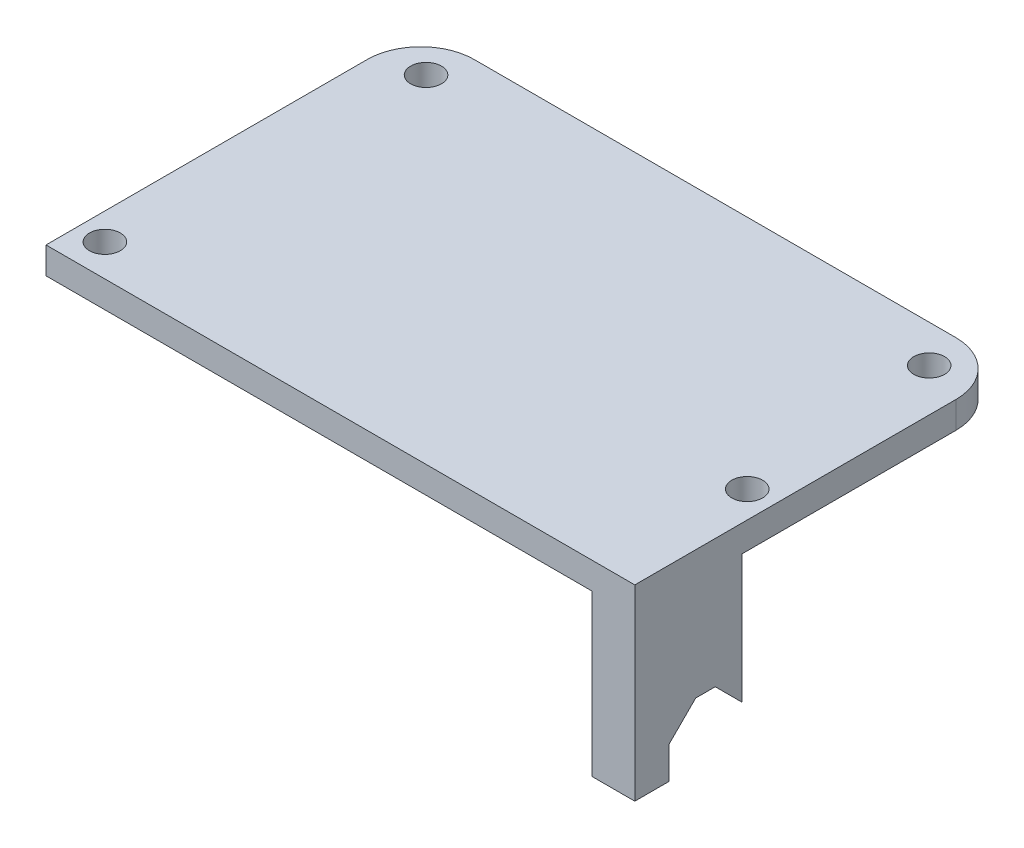
ISO-10303-21;
HEADER;
FILE_DESCRIPTION(('STEP AP214'),'2;1');
FILE_NAME('part.step','',(''),(''),'','','');
FILE_SCHEMA(('AUTOMOTIVE_DESIGN { 1 0 10303 214 1 1 1 1 }'));
ENDSEC;
DATA;
#1=APPLICATION_CONTEXT('core data for automotive mechanical design processes');
#2=APPLICATION_PROTOCOL_DEFINITION('international standard','automotive_design',2000,#1);
#3=PRODUCT_CONTEXT('',#1,'mechanical');
#4=PRODUCT('Part','Part','',(#3));
#5=PRODUCT_RELATED_PRODUCT_CATEGORY('part','',(#4));
#6=PRODUCT_DEFINITION_FORMATION('','',#4);
#7=PRODUCT_DEFINITION_CONTEXT('part definition',#1,'design');
#8=PRODUCT_DEFINITION('design','',#6,#7);
#9=PRODUCT_DEFINITION_SHAPE('','',#8);
#10=(LENGTH_UNIT() NAMED_UNIT(*) SI_UNIT(.MILLI.,.METRE.));
#11=(NAMED_UNIT(*) PLANE_ANGLE_UNIT() SI_UNIT($,.RADIAN.));
#12=(NAMED_UNIT(*) SI_UNIT($,.STERADIAN.) SOLID_ANGLE_UNIT());
#13=UNCERTAINTY_MEASURE_WITH_UNIT(LENGTH_MEASURE(1.E-05),#10,'distance_accuracy_value','');
#14=(GEOMETRIC_REPRESENTATION_CONTEXT(3) GLOBAL_UNCERTAINTY_ASSIGNED_CONTEXT((#13)) GLOBAL_UNIT_ASSIGNED_CONTEXT((#10,
#11,#12)) REPRESENTATION_CONTEXT('',''));
#15=CARTESIAN_POINT('',(0.,0.,0.));
#16=DIRECTION('',(0.,0.,1.));
#17=DIRECTION('',(1.,0.,0.));
#18=AXIS2_PLACEMENT_3D('',#15,#16,#17);
#19=CARTESIAN_POINT('',(34.925,3.175,22.225));
#20=DIRECTION('',(-1.,0.,0.));
#21=DIRECTION('',(0.,0.,1.));
#22=AXIS2_PLACEMENT_3D('',#19,#20,#21);
#23=PLANE('',#22);
#24=DIRECTION('',(0.,0.,-1.));
#25=VECTOR('',#24,1.);
#26=CARTESIAN_POINT('',(34.925,0.,22.225));
#27=LINE('',#26,#25);
#28=CARTESIAN_POINT('',(34.925,0.,9.525));
#29=VERTEX_POINT('',#28);
#30=CARTESIAN_POINT('',(34.925,0.,-15.875));
#31=VERTEX_POINT('',#30);
#32=EDGE_CURVE('E195',#29,#31,#27,.T.);
#33=ORIENTED_EDGE('',*,*,#32,.T.);
#34=DIRECTION('',(0.,-1.,0.));
#35=VECTOR('',#34,1.);
#36=CARTESIAN_POINT('',(34.925,3.175,-15.875));
#37=LINE('',#36,#35);
#38=CARTESIAN_POINT('',(34.925,3.175,-15.875));
#39=VERTEX_POINT('',#38);
#40=EDGE_CURVE('E11',#31,#39,#37,.F.);
#41=ORIENTED_EDGE('',*,*,#40,.T.);
#42=DIRECTION('',(0.,0.,-1.));
#43=VECTOR('',#42,1.);
#44=CARTESIAN_POINT('',(34.925,3.175,22.225));
#45=LINE('',#44,#43);
#46=CARTESIAN_POINT('',(34.925,3.175,22.225));
#47=VERTEX_POINT('',#46);
#48=EDGE_CURVE('E207',#47,#39,#45,.T.);
#49=ORIENTED_EDGE('',*,*,#48,.F.);
#50=DIRECTION('',(0.,-1.,0.));
#51=VECTOR('',#50,1.);
#52=CARTESIAN_POINT('',(34.925,3.175,22.225));
#53=LINE('',#52,#51);
#54=CARTESIAN_POINT('',(34.925,-19.05,22.225));
#55=VERTEX_POINT('',#54);
#56=EDGE_CURVE('E216',#47,#55,#53,.T.);
#57=ORIENTED_EDGE('',*,*,#56,.T.);
#58=DIRECTION('',(0.,0.,-1.));
#59=VECTOR('',#58,1.);
#60=CARTESIAN_POINT('',(34.925,-19.05,22.225));
#61=LINE('',#60,#59);
#62=CARTESIAN_POINT('',(34.925,-19.05,18.161));
#63=VERTEX_POINT('',#62);
#64=EDGE_CURVE('E189',#55,#63,#61,.T.);
#65=ORIENTED_EDGE('',*,*,#64,.T.);
#66=DIRECTION('',(0.,1.,0.));
#67=VECTOR('',#66,1.);
#68=CARTESIAN_POINT('',(34.925,-19.05,18.161));
#69=LINE('',#68,#67);
#70=CARTESIAN_POINT('',(34.925,-15.2219532999745,18.161));
#71=VERTEX_POINT('',#70);
#72=EDGE_CURVE('E164',#63,#71,#69,.T.);
#73=ORIENTED_EDGE('',*,*,#72,.T.);
#74=DIRECTION('',(0.,0.707108203483021,-0.707105358887214));
#75=VECTOR('',#74,1.);
#76=CARTESIAN_POINT('',(34.925,-15.2219532999745,18.161));
#77=LINE('',#76,#75);
#78=CARTESIAN_POINT('',(34.925,-12.065,15.0040594));
#79=VERTEX_POINT('',#78);
#80=EDGE_CURVE('E161',#71,#79,#77,.T.);
#81=ORIENTED_EDGE('',*,*,#80,.T.);
#82=DIRECTION('',(0.,0.,-1.));
#83=VECTOR('',#82,1.);
#84=CARTESIAN_POINT('',(34.925,-12.065,15.0040594));
#85=LINE('',#84,#83);
#86=CARTESIAN_POINT('',(34.925,-12.065,12.681966));
#87=VERTEX_POINT('',#86);
#88=EDGE_CURVE('E183',#79,#87,#85,.T.);
#89=ORIENTED_EDGE('',*,*,#88,.T.);
#90=DIRECTION('',(0.,-0.707105358887214,-0.707108203483021));
#91=VECTOR('',#90,1.);
#92=CARTESIAN_POINT('',(34.925,-12.065,12.681966));
#93=LINE('',#92,#91);
#94=CARTESIAN_POINT('',(34.925,-15.2219532999745,9.525));
#95=VERTEX_POINT('',#94);
#96=EDGE_CURVE('E140',#87,#95,#93,.T.);
#97=ORIENTED_EDGE('',*,*,#96,.T.);
#98=DIRECTION('',(0.,1.,0.));
#99=VECTOR('',#98,1.);
#100=CARTESIAN_POINT('',(34.925,-15.2219532999745,9.525));
#101=LINE('',#100,#99);
#102=EDGE_CURVE('E186',#95,#29,#101,.T.);
#103=ORIENTED_EDGE('',*,*,#102,.T.);
#104=EDGE_LOOP('',(#33,#41,#49,#57,#65,#73,#81,#89,#97,#103));
#105=FACE_BOUND('',#104,.T.);
#106=ADVANCED_FACE('F38',(#105),#23,.F.);
#107=CARTESIAN_POINT('',(-34.925,3.175,-22.225));
#108=DIRECTION('',(0.,0.,1.));
#109=DIRECTION('',(1.,0.,0.));
#110=AXIS2_PLACEMENT_3D('',#107,#108,#109);
#111=PLANE('',#110);
#112=DIRECTION('',(-1.,0.,0.));
#113=VECTOR('',#112,1.);
#114=CARTESIAN_POINT('',(-34.925,0.,-22.225));
#115=LINE('',#114,#113);
#116=CARTESIAN_POINT('',(28.575,0.,-22.225));
#117=VERTEX_POINT('',#116);
#118=CARTESIAN_POINT('',(-28.575,0.,-22.225));
#119=VERTEX_POINT('',#118);
#120=EDGE_CURVE('E218',#117,#119,#115,.T.);
#121=ORIENTED_EDGE('',*,*,#120,.T.);
#122=DIRECTION('',(0.,-1.,0.));
#123=VECTOR('',#122,1.);
#124=CARTESIAN_POINT('',(-28.575,3.175,-22.225));
#125=LINE('',#124,#123);
#126=CARTESIAN_POINT('',(-28.575,3.175,-22.225));
#127=VERTEX_POINT('',#126);
#128=EDGE_CURVE('E59',#119,#127,#125,.F.);
#129=ORIENTED_EDGE('',*,*,#128,.T.);
#130=DIRECTION('',(-1.,0.,0.));
#131=VECTOR('',#130,1.);
#132=CARTESIAN_POINT('',(-34.925,3.175,-22.225));
#133=LINE('',#132,#131);
#134=CARTESIAN_POINT('',(28.575,3.175,-22.225));
#135=VERTEX_POINT('',#134);
#136=EDGE_CURVE('E209',#135,#127,#133,.T.);
#137=ORIENTED_EDGE('',*,*,#136,.F.);
#138=DIRECTION('',(0.,-1.,0.));
#139=VECTOR('',#138,1.);
#140=CARTESIAN_POINT('',(28.575,3.175,-22.225));
#141=LINE('',#140,#139);
#142=EDGE_CURVE('E235',#135,#117,#141,.T.);
#143=ORIENTED_EDGE('',*,*,#142,.T.);
#144=EDGE_LOOP('',(#121,#129,#137,#143));
#145=FACE_BOUND('',#144,.T.);
#146=ADVANCED_FACE('F256',(#145),#111,.F.);
#147=CARTESIAN_POINT('',(-34.925,3.175,22.225));
#148=DIRECTION('',(1.,0.,0.));
#149=DIRECTION('',(0.,0.,-1.));
#150=AXIS2_PLACEMENT_3D('',#147,#148,#149);
#151=PLANE('',#150);
#152=DIRECTION('',(0.,0.,1.));
#153=VECTOR('',#152,1.);
#154=CARTESIAN_POINT('',(-34.925,3.175,22.225));
#155=LINE('',#154,#153);
#156=CARTESIAN_POINT('',(-34.925,3.175,-15.875));
#157=VERTEX_POINT('',#156);
#158=CARTESIAN_POINT('',(-34.925,3.175,22.225));
#159=VERTEX_POINT('',#158);
#160=EDGE_CURVE('E212',#157,#159,#155,.T.);
#161=ORIENTED_EDGE('',*,*,#160,.F.);
#162=DIRECTION('',(0.,-1.,0.));
#163=VECTOR('',#162,1.);
#164=CARTESIAN_POINT('',(-34.925,3.175,-15.875));
#165=LINE('',#164,#163);
#166=CARTESIAN_POINT('',(-34.925,0.,-15.875));
#167=VERTEX_POINT('',#166);
#168=EDGE_CURVE('E228',#157,#167,#165,.T.);
#169=ORIENTED_EDGE('',*,*,#168,.T.);
#170=DIRECTION('',(0.,0.,1.));
#171=VECTOR('',#170,1.);
#172=CARTESIAN_POINT('',(-34.925,0.,22.225));
#173=LINE('',#172,#171);
#174=CARTESIAN_POINT('',(-34.925,0.,22.225));
#175=VERTEX_POINT('',#174);
#176=EDGE_CURVE('E220',#167,#175,#173,.T.);
#177=ORIENTED_EDGE('',*,*,#176,.T.);
#178=DIRECTION('',(0.,-1.,0.));
#179=VECTOR('',#178,1.);
#180=CARTESIAN_POINT('',(-34.925,3.175,22.225));
#181=LINE('',#180,#179);
#182=EDGE_CURVE('E225',#159,#175,#181,.T.);
#183=ORIENTED_EDGE('',*,*,#182,.F.);
#184=EDGE_LOOP('',(#161,#169,#177,#183));
#185=FACE_BOUND('',#184,.T.);
#186=ADVANCED_FACE('F248',(#185),#151,.F.);
#187=CARTESIAN_POINT('',(-34.925,3.175,22.225));
#188=DIRECTION('',(0.,0.,-1.));
#189=DIRECTION('',(-1.,0.,0.));
#190=AXIS2_PLACEMENT_3D('',#187,#188,#189);
#191=PLANE('',#190);
#192=DIRECTION('',(1.,0.,0.));
#193=VECTOR('',#192,1.);
#194=CARTESIAN_POINT('',(-34.925,0.,22.225));
#195=LINE('',#194,#193);
#196=CARTESIAN_POINT('',(29.845,0.,22.225));
#197=VERTEX_POINT('',#196);
#198=EDGE_CURVE('E210',#175,#197,#195,.T.);
#199=ORIENTED_EDGE('',*,*,#198,.T.);
#200=DIRECTION('',(0.,-1.,0.));
#201=VECTOR('',#200,1.);
#202=CARTESIAN_POINT('',(29.845,0.,22.225));
#203=LINE('',#202,#201);
#204=CARTESIAN_POINT('',(29.845,-19.05,22.225));
#205=VERTEX_POINT('',#204);
#206=EDGE_CURVE('E173',#197,#205,#203,.T.);
#207=ORIENTED_EDGE('',*,*,#206,.T.);
#208=DIRECTION('',(1.,0.,0.));
#209=VECTOR('',#208,1.);
#210=CARTESIAN_POINT('',(29.845,-19.05,22.225));
#211=LINE('',#210,#209);
#212=EDGE_CURVE('E200',#205,#55,#211,.T.);
#213=ORIENTED_EDGE('',*,*,#212,.T.);
#214=ORIENTED_EDGE('',*,*,#56,.F.);
#215=DIRECTION('',(1.,0.,0.));
#216=VECTOR('',#215,1.);
#217=CARTESIAN_POINT('',(-34.925,3.175,22.225));
#218=LINE('',#217,#216);
#219=EDGE_CURVE('E214',#159,#47,#218,.T.);
#220=ORIENTED_EDGE('',*,*,#219,.F.);
#221=ORIENTED_EDGE('',*,*,#182,.T.);
#222=EDGE_LOOP('',(#199,#207,#213,#214,#220,#221));
#223=FACE_BOUND('',#222,.T.);
#224=ADVANCED_FACE('F267',(#223),#191,.F.);
#225=CARTESIAN_POINT('',(0.,3.175,0.));
#226=DIRECTION('',(0.,-1.,0.));
#227=DIRECTION('',(0.,0.,-1.));
#228=AXIS2_PLACEMENT_3D('',#225,#226,#227);
#229=PLANE('',#228);
#230=CARTESIAN_POINT('',(29.845,3.175,-17.78));
#231=DIRECTION('',(0.,-1.,0.));
#232=DIRECTION('',(0.,0.,-1.));
#233=AXIS2_PLACEMENT_3D('',#230,#231,#232);
#234=CIRCLE('',#233,1.82879999999999);
#235=CARTESIAN_POINT('',(29.845,3.175,-19.6088));
#236=VERTEX_POINT('',#235);
#237=EDGE_CURVE('E327',#236,#236,#234,.T.);
#238=ORIENTED_EDGE('',*,*,#237,.T.);
#239=EDGE_LOOP('',(#238));
#240=FACE_BOUND('',#239,.T.);
#241=CARTESIAN_POINT('',(-29.845,3.175,-17.78));
#242=DIRECTION('',(0.,-1.,0.));
#243=DIRECTION('',(0.,0.,-1.));
#244=AXIS2_PLACEMENT_3D('',#241,#242,#243);
#245=CIRCLE('',#244,1.82879999999999);
#246=CARTESIAN_POINT('',(-29.845,3.175,-19.6088));
#247=VERTEX_POINT('',#246);
#248=EDGE_CURVE('E332',#247,#247,#245,.T.);
#249=ORIENTED_EDGE('',*,*,#248,.T.);
#250=EDGE_LOOP('',(#249));
#251=FACE_BOUND('',#250,.T.);
#252=CARTESIAN_POINT('',(-31.75,3.175,18.415));
#253=DIRECTION('',(0.,-1.,0.));
#254=DIRECTION('',(0.,0.,-1.));
#255=AXIS2_PLACEMENT_3D('',#252,#253,#254);
#256=CIRCLE('',#255,1.82879999999999);
#257=CARTESIAN_POINT('',(-31.75,3.175,16.5862));
#258=VERTEX_POINT('',#257);
#259=EDGE_CURVE('E341',#258,#258,#256,.T.);
#260=ORIENTED_EDGE('',*,*,#259,.T.);
#261=EDGE_LOOP('',(#260));
#262=FACE_BOUND('',#261,.T.);
#263=CARTESIAN_POINT('',(31.75,3.175,5.71500000000001));
#264=DIRECTION('',(0.,-1.,0.));
#265=DIRECTION('',(0.,0.,-1.));
#266=AXIS2_PLACEMENT_3D('',#263,#264,#265);
#267=CIRCLE('',#266,1.82879999999999);
#268=CARTESIAN_POINT('',(31.75,3.175,3.88620000000001));
#269=VERTEX_POINT('',#268);
#270=EDGE_CURVE('E167',#269,#269,#267,.T.);
#271=ORIENTED_EDGE('',*,*,#270,.T.);
#272=EDGE_LOOP('',(#271));
#273=FACE_BOUND('',#272,.T.);
#274=ORIENTED_EDGE('',*,*,#136,.T.);
#275=CARTESIAN_POINT('',(-28.575,3.175,-15.875));
#276=DIRECTION('',(0.,-1.,0.));
#277=DIRECTION('',(0.,0.,-1.));
#278=AXIS2_PLACEMENT_3D('',#275,#276,#277);
#279=CIRCLE('',#278,6.35);
#280=EDGE_CURVE('E46',#127,#157,#279,.F.);
#281=ORIENTED_EDGE('',*,*,#280,.T.);
#282=ORIENTED_EDGE('',*,*,#160,.T.);
#283=ORIENTED_EDGE('',*,*,#219,.T.);
#284=ORIENTED_EDGE('',*,*,#48,.T.);
#285=CARTESIAN_POINT('',(28.575,3.175,-15.875));
#286=DIRECTION('',(0.,-1.,0.));
#287=DIRECTION('',(0.,0.,-1.));
#288=AXIS2_PLACEMENT_3D('',#285,#286,#287);
#289=CIRCLE('',#288,6.35);
#290=EDGE_CURVE('E239',#39,#135,#289,.F.);
#291=ORIENTED_EDGE('',*,*,#290,.T.);
#292=EDGE_LOOP('',(#274,#281,#282,#283,#284,#291));
#293=FACE_BOUND('',#292,.T.);
#294=ADVANCED_FACE('F243',(#240,#251,#262,#273,#293),#229,.F.);
#295=CARTESIAN_POINT('',(0.,0.,0.));
#296=DIRECTION('',(0.,-1.,0.));
#297=DIRECTION('',(0.,0.,-1.));
#298=AXIS2_PLACEMENT_3D('',#295,#296,#297);
#299=PLANE('',#298);
#300=CARTESIAN_POINT('',(29.845,0.,-17.78));
#301=DIRECTION('',(0.,-1.,0.));
#302=DIRECTION('',(0.,0.,-1.));
#303=AXIS2_PLACEMENT_3D('',#300,#301,#302);
#304=CIRCLE('',#303,1.8288);
#305=CARTESIAN_POINT('',(29.845,0.,-19.6088));
#306=VERTEX_POINT('',#305);
#307=EDGE_CURVE('E324',#306,#306,#304,.T.);
#308=ORIENTED_EDGE('',*,*,#307,.F.);
#309=EDGE_LOOP('',(#308));
#310=FACE_BOUND('',#309,.T.);
#311=CARTESIAN_POINT('',(-29.845,0.,-17.78));
#312=DIRECTION('',(0.,-1.,0.));
#313=DIRECTION('',(0.,0.,-1.));
#314=AXIS2_PLACEMENT_3D('',#311,#312,#313);
#315=CIRCLE('',#314,1.8288);
#316=CARTESIAN_POINT('',(-29.845,0.,-19.6088));
#317=VERTEX_POINT('',#316);
#318=EDGE_CURVE('E329',#317,#317,#315,.T.);
#319=ORIENTED_EDGE('',*,*,#318,.F.);
#320=EDGE_LOOP('',(#319));
#321=FACE_BOUND('',#320,.T.);
#322=CARTESIAN_POINT('',(-31.75,0.,18.415));
#323=DIRECTION('',(0.,-1.,0.));
#324=DIRECTION('',(0.,0.,-1.));
#325=AXIS2_PLACEMENT_3D('',#322,#323,#324);
#326=CIRCLE('',#325,1.8288);
#327=CARTESIAN_POINT('',(-31.75,0.,16.5862));
#328=VERTEX_POINT('',#327);
#329=EDGE_CURVE('E338',#328,#328,#326,.T.);
#330=ORIENTED_EDGE('',*,*,#329,.F.);
#331=EDGE_LOOP('',(#330));
#332=FACE_BOUND('',#331,.T.);
#333=CARTESIAN_POINT('',(31.75,0.,5.71500000000001));
#334=DIRECTION('',(0.,-1.,0.));
#335=DIRECTION('',(0.,0.,-1.));
#336=AXIS2_PLACEMENT_3D('',#333,#334,#335);
#337=CIRCLE('',#336,1.82879999999999);
#338=CARTESIAN_POINT('',(31.75,0.,3.88620000000001));
#339=VERTEX_POINT('',#338);
#340=EDGE_CURVE('E343',#339,#339,#337,.T.);
#341=ORIENTED_EDGE('',*,*,#340,.F.);
#342=EDGE_LOOP('',(#341));
#343=FACE_BOUND('',#342,.T.);
#344=ORIENTED_EDGE('',*,*,#176,.F.);
#345=CARTESIAN_POINT('',(-28.575,0.,-15.875));
#346=DIRECTION('',(0.,-1.,0.));
#347=DIRECTION('',(0.,0.,-1.));
#348=AXIS2_PLACEMENT_3D('',#345,#346,#347);
#349=CIRCLE('',#348,6.35);
#350=EDGE_CURVE('E233',#167,#119,#349,.T.);
#351=ORIENTED_EDGE('',*,*,#350,.T.);
#352=ORIENTED_EDGE('',*,*,#120,.F.);
#353=CARTESIAN_POINT('',(28.575,0.,-15.875));
#354=DIRECTION('',(0.,-1.,0.));
#355=DIRECTION('',(0.,0.,-1.));
#356=AXIS2_PLACEMENT_3D('',#353,#354,#355);
#357=CIRCLE('',#356,6.35);
#358=EDGE_CURVE('E231',#117,#31,#357,.T.);
#359=ORIENTED_EDGE('',*,*,#358,.T.);
#360=ORIENTED_EDGE('',*,*,#32,.F.);
#361=DIRECTION('',(1.,0.,0.));
#362=VECTOR('',#361,1.);
#363=CARTESIAN_POINT('',(29.845,0.,9.525));
#364=LINE('',#363,#362);
#365=CARTESIAN_POINT('',(29.845,0.,9.525));
#366=VERTEX_POINT('',#365);
#367=EDGE_CURVE('E203',#366,#29,#364,.T.);
#368=ORIENTED_EDGE('',*,*,#367,.F.);
#369=DIRECTION('',(0.,0.,-1.));
#370=VECTOR('',#369,1.);
#371=CARTESIAN_POINT('',(29.845,0.,22.225));
#372=LINE('',#371,#370);
#373=EDGE_CURVE('E171',#197,#366,#372,.T.);
#374=ORIENTED_EDGE('',*,*,#373,.F.);
#375=ORIENTED_EDGE('',*,*,#198,.F.);
#376=EDGE_LOOP('',(#344,#351,#352,#359,#360,#368,#374,#375));
#377=FACE_BOUND('',#376,.T.);
#378=ADVANCED_FACE('F254',(#310,#321,#332,#343,#377),#299,.T.);
#379=CARTESIAN_POINT('',(29.845,-12.065,15.0040594));
#380=DIRECTION('',(0.,-1.,0.));
#381=DIRECTION('',(0.,0.,-1.));
#382=AXIS2_PLACEMENT_3D('',#379,#380,#381);
#383=PLANE('',#382);
#384=ORIENTED_EDGE('',*,*,#88,.F.);
#385=DIRECTION('',(1.,0.,0.));
#386=VECTOR('',#385,1.);
#387=CARTESIAN_POINT('',(29.845,-12.065,15.0040594));
#388=LINE('',#387,#386);
#389=CARTESIAN_POINT('',(29.845,-12.065,15.0040594));
#390=VERTEX_POINT('',#389);
#391=EDGE_CURVE('E160',#390,#79,#388,.T.);
#392=ORIENTED_EDGE('',*,*,#391,.F.);
#393=DIRECTION('',(0.,0.,-1.));
#394=VECTOR('',#393,1.);
#395=CARTESIAN_POINT('',(29.845,-12.065,15.0040594));
#396=LINE('',#395,#394);
#397=CARTESIAN_POINT('',(29.845,-12.065,12.681966));
#398=VERTEX_POINT('',#397);
#399=EDGE_CURVE('E153',#390,#398,#396,.T.);
#400=ORIENTED_EDGE('',*,*,#399,.T.);
#401=DIRECTION('',(1.,0.,0.));
#402=VECTOR('',#401,1.);
#403=CARTESIAN_POINT('',(29.845,-12.065,12.681966));
#404=LINE('',#403,#402);
#405=EDGE_CURVE('E135',#398,#87,#404,.T.);
#406=ORIENTED_EDGE('',*,*,#405,.T.);
#407=EDGE_LOOP('',(#384,#392,#400,#406));
#408=FACE_BOUND('',#407,.T.);
#409=ADVANCED_FACE('F159',(#408),#383,.T.);
#410=CARTESIAN_POINT('',(29.845,-15.2219532999745,18.161));
#411=DIRECTION('',(0.,-0.707105358887213,-0.707108203483021));
#412=DIRECTION('',(0.,0.707108203483021,-0.707105358887214));
#413=AXIS2_PLACEMENT_3D('',#410,#411,#412);
#414=PLANE('',#413);
#415=ORIENTED_EDGE('',*,*,#80,.F.);
#416=DIRECTION('',(1.,0.,0.));
#417=VECTOR('',#416,1.);
#418=CARTESIAN_POINT('',(29.845,-15.2219532999745,18.161));
#419=LINE('',#418,#417);
#420=CARTESIAN_POINT('',(29.845,-15.2219532999745,18.161));
#421=VERTEX_POINT('',#420);
#422=EDGE_CURVE('E196',#421,#71,#419,.T.);
#423=ORIENTED_EDGE('',*,*,#422,.F.);
#424=DIRECTION('',(0.,0.707108203483021,-0.707105358887214));
#425=VECTOR('',#424,1.);
#426=CARTESIAN_POINT('',(29.845,-15.2219532999745,18.161));
#427=LINE('',#426,#425);
#428=EDGE_CURVE('E146',#421,#390,#427,.T.);
#429=ORIENTED_EDGE('',*,*,#428,.T.);
#430=ORIENTED_EDGE('',*,*,#391,.T.);
#431=EDGE_LOOP('',(#415,#423,#429,#430));
#432=FACE_BOUND('',#431,.T.);
#433=ADVANCED_FACE('F277',(#432),#414,.T.);
#434=CARTESIAN_POINT('',(29.845,-19.05,18.161));
#435=DIRECTION('',(0.,0.,-1.));
#436=DIRECTION('',(-1.,0.,0.));
#437=AXIS2_PLACEMENT_3D('',#434,#435,#436);
#438=PLANE('',#437);
#439=ORIENTED_EDGE('',*,*,#72,.F.);
#440=DIRECTION('',(1.,0.,0.));
#441=VECTOR('',#440,1.);
#442=CARTESIAN_POINT('',(29.845,-19.05,18.161));
#443=LINE('',#442,#441);
#444=CARTESIAN_POINT('',(29.845,-19.05,18.161));
#445=VERTEX_POINT('',#444);
#446=EDGE_CURVE('E198',#445,#63,#443,.T.);
#447=ORIENTED_EDGE('',*,*,#446,.F.);
#448=DIRECTION('',(0.,1.,0.));
#449=VECTOR('',#448,1.);
#450=CARTESIAN_POINT('',(29.845,-19.05,18.161));
#451=LINE('',#450,#449);
#452=EDGE_CURVE('E179',#445,#421,#451,.T.);
#453=ORIENTED_EDGE('',*,*,#452,.T.);
#454=ORIENTED_EDGE('',*,*,#422,.T.);
#455=EDGE_LOOP('',(#439,#447,#453,#454));
#456=FACE_BOUND('',#455,.T.);
#457=ADVANCED_FACE('F275',(#456),#438,.T.);
#458=CARTESIAN_POINT('',(29.845,-19.05,22.225));
#459=DIRECTION('',(0.,-1.,0.));
#460=DIRECTION('',(0.,0.,-1.));
#461=AXIS2_PLACEMENT_3D('',#458,#459,#460);
#462=PLANE('',#461);
#463=ORIENTED_EDGE('',*,*,#64,.F.);
#464=ORIENTED_EDGE('',*,*,#212,.F.);
#465=DIRECTION('',(0.,0.,-1.));
#466=VECTOR('',#465,1.);
#467=CARTESIAN_POINT('',(29.845,-19.05,22.225));
#468=LINE('',#467,#466);
#469=EDGE_CURVE('E176',#205,#445,#468,.T.);
#470=ORIENTED_EDGE('',*,*,#469,.T.);
#471=ORIENTED_EDGE('',*,*,#446,.T.);
#472=EDGE_LOOP('',(#463,#464,#470,#471));
#473=FACE_BOUND('',#472,.T.);
#474=ADVANCED_FACE('F273',(#473),#462,.T.);
#475=CARTESIAN_POINT('',(29.845,-15.2219532999745,9.525));
#476=DIRECTION('',(0.,0.,-1.));
#477=DIRECTION('',(-1.,0.,0.));
#478=AXIS2_PLACEMENT_3D('',#475,#476,#477);
#479=PLANE('',#478);
#480=ORIENTED_EDGE('',*,*,#102,.F.);
#481=DIRECTION('',(1.,0.,0.));
#482=VECTOR('',#481,1.);
#483=CARTESIAN_POINT('',(29.845,-15.2219532999745,9.525));
#484=LINE('',#483,#482);
#485=CARTESIAN_POINT('',(29.845,-15.2219532999745,9.525));
#486=VERTEX_POINT('',#485);
#487=EDGE_CURVE('E145',#486,#95,#484,.T.);
#488=ORIENTED_EDGE('',*,*,#487,.F.);
#489=DIRECTION('',(0.,1.,0.));
#490=VECTOR('',#489,1.);
#491=CARTESIAN_POINT('',(29.845,-15.2219532999745,9.525));
#492=LINE('',#491,#490);
#493=EDGE_CURVE('E157',#486,#366,#492,.T.);
#494=ORIENTED_EDGE('',*,*,#493,.T.);
#495=ORIENTED_EDGE('',*,*,#367,.T.);
#496=EDGE_LOOP('',(#480,#488,#494,#495));
#497=FACE_BOUND('',#496,.T.);
#498=ADVANCED_FACE('F262',(#497),#479,.T.);
#499=CARTESIAN_POINT('',(29.845,-12.065,12.681966));
#500=DIRECTION('',(0.,-0.707108203483021,0.707105358887214));
#501=DIRECTION('',(0.,-0.707105358887214,-0.707108203483021));
#502=AXIS2_PLACEMENT_3D('',#499,#500,#501);
#503=PLANE('',#502);
#504=ORIENTED_EDGE('',*,*,#96,.F.);
#505=ORIENTED_EDGE('',*,*,#405,.F.);
#506=DIRECTION('',(0.,-0.707105358887214,-0.707108203483021));
#507=VECTOR('',#506,1.);
#508=CARTESIAN_POINT('',(29.845,-12.065,12.681966));
#509=LINE('',#508,#507);
#510=EDGE_CURVE('E138',#398,#486,#509,.T.);
#511=ORIENTED_EDGE('',*,*,#510,.T.);
#512=ORIENTED_EDGE('',*,*,#487,.T.);
#513=EDGE_LOOP('',(#504,#505,#511,#512));
#514=FACE_BOUND('',#513,.T.);
#515=ADVANCED_FACE('F137',(#514),#503,.T.);
#516=CARTESIAN_POINT('',(29.845,0.,0.));
#517=DIRECTION('',(1.,0.,0.));
#518=DIRECTION('',(0.,0.,-1.));
#519=AXIS2_PLACEMENT_3D('',#516,#517,#518);
#520=PLANE('',#519);
#521=ORIENTED_EDGE('',*,*,#399,.F.);
#522=ORIENTED_EDGE('',*,*,#428,.F.);
#523=ORIENTED_EDGE('',*,*,#452,.F.);
#524=ORIENTED_EDGE('',*,*,#469,.F.);
#525=ORIENTED_EDGE('',*,*,#206,.F.);
#526=ORIENTED_EDGE('',*,*,#373,.T.);
#527=ORIENTED_EDGE('',*,*,#493,.F.);
#528=ORIENTED_EDGE('',*,*,#510,.F.);
#529=EDGE_LOOP('',(#521,#522,#523,#524,#525,#526,#527,#528));
#530=FACE_BOUND('',#529,.T.);
#531=ADVANCED_FACE('F151',(#530),#520,.F.);
#532=CARTESIAN_POINT('',(-28.575,3.175,-15.875));
#533=DIRECTION('',(0.,-1.,0.));
#534=DIRECTION('',(0.,0.,-1.));
#535=AXIS2_PLACEMENT_3D('',#532,#533,#534);
#536=CYLINDRICAL_SURFACE('',#535,6.35);
#537=ORIENTED_EDGE('',*,*,#280,.F.);
#538=ORIENTED_EDGE('',*,*,#128,.F.);
#539=ORIENTED_EDGE('',*,*,#350,.F.);
#540=ORIENTED_EDGE('',*,*,#168,.F.);
#541=EDGE_LOOP('',(#537,#538,#539,#540));
#542=FACE_BOUND('',#541,.T.);
#543=ADVANCED_FACE('F251',(#542),#536,.T.);
#544=CARTESIAN_POINT('',(28.575,3.175,-15.875));
#545=DIRECTION('',(0.,-1.,0.));
#546=DIRECTION('',(0.,0.,-1.));
#547=AXIS2_PLACEMENT_3D('',#544,#545,#546);
#548=CYLINDRICAL_SURFACE('',#547,6.35);
#549=ORIENTED_EDGE('',*,*,#290,.F.);
#550=ORIENTED_EDGE('',*,*,#40,.F.);
#551=ORIENTED_EDGE('',*,*,#358,.F.);
#552=ORIENTED_EDGE('',*,*,#142,.F.);
#553=EDGE_LOOP('',(#549,#550,#551,#552));
#554=FACE_BOUND('',#553,.T.);
#555=ADVANCED_FACE('F40',(#554),#548,.T.);
#556=CARTESIAN_POINT('',(31.75,0.,5.71500000000001));
#557=DIRECTION('',(0.,-1.,0.));
#558=DIRECTION('',(0.,0.,-1.));
#559=AXIS2_PLACEMENT_3D('',#556,#557,#558);
#560=CYLINDRICAL_SURFACE('',#559,1.82879999999999);
#561=ORIENTED_EDGE('',*,*,#340,.T.);
#562=EDGE_LOOP('',(#561));
#563=FACE_BOUND('',#562,.T.);
#564=ORIENTED_EDGE('',*,*,#270,.F.);
#565=EDGE_LOOP('',(#564));
#566=FACE_BOUND('',#565,.T.);
#567=ADVANCED_FACE('F299',(#563,#566),#560,.F.);
#568=CARTESIAN_POINT('',(-31.75,0.,18.415));
#569=DIRECTION('',(0.,-1.,0.));
#570=DIRECTION('',(0.,0.,-1.));
#571=AXIS2_PLACEMENT_3D('',#568,#569,#570);
#572=CYLINDRICAL_SURFACE('',#571,1.82879999999999);
#573=ORIENTED_EDGE('',*,*,#329,.T.);
#574=EDGE_LOOP('',(#573));
#575=FACE_BOUND('',#574,.T.);
#576=ORIENTED_EDGE('',*,*,#259,.F.);
#577=EDGE_LOOP('',(#576));
#578=FACE_BOUND('',#577,.T.);
#579=ADVANCED_FACE('F307',(#575,#578),#572,.F.);
#580=CARTESIAN_POINT('',(-29.845,0.,-17.78));
#581=DIRECTION('',(0.,-1.,0.));
#582=DIRECTION('',(0.,0.,-1.));
#583=AXIS2_PLACEMENT_3D('',#580,#581,#582);
#584=CYLINDRICAL_SURFACE('',#583,1.82879999999999);
#585=ORIENTED_EDGE('',*,*,#318,.T.);
#586=EDGE_LOOP('',(#585));
#587=FACE_BOUND('',#586,.T.);
#588=ORIENTED_EDGE('',*,*,#248,.F.);
#589=EDGE_LOOP('',(#588));
#590=FACE_BOUND('',#589,.T.);
#591=ADVANCED_FACE('F311',(#587,#590),#584,.F.);
#592=CARTESIAN_POINT('',(29.845,0.,-17.78));
#593=DIRECTION('',(0.,-1.,0.));
#594=DIRECTION('',(0.,0.,-1.));
#595=AXIS2_PLACEMENT_3D('',#592,#593,#594);
#596=CYLINDRICAL_SURFACE('',#595,1.82879999999999);
#597=ORIENTED_EDGE('',*,*,#307,.T.);
#598=EDGE_LOOP('',(#597));
#599=FACE_BOUND('',#598,.T.);
#600=ORIENTED_EDGE('',*,*,#237,.F.);
#601=EDGE_LOOP('',(#600));
#602=FACE_BOUND('',#601,.T.);
#603=ADVANCED_FACE('F315',(#599,#602),#596,.F.);
#604=CLOSED_SHELL('',(#106,#146,#186,#224,#294,#378,#409,#433,#457,#474,#498,#515,#531,#543,
#555,#567,#579,#591,#603));
#605=MANIFOLD_SOLID_BREP('B2',#604);
#606=ADVANCED_BREP_SHAPE_REPRESENTATION('',(#18,#605),#14);
#607=SHAPE_DEFINITION_REPRESENTATION(#9,#606);
ENDSEC;
END-ISO-10303-21;
